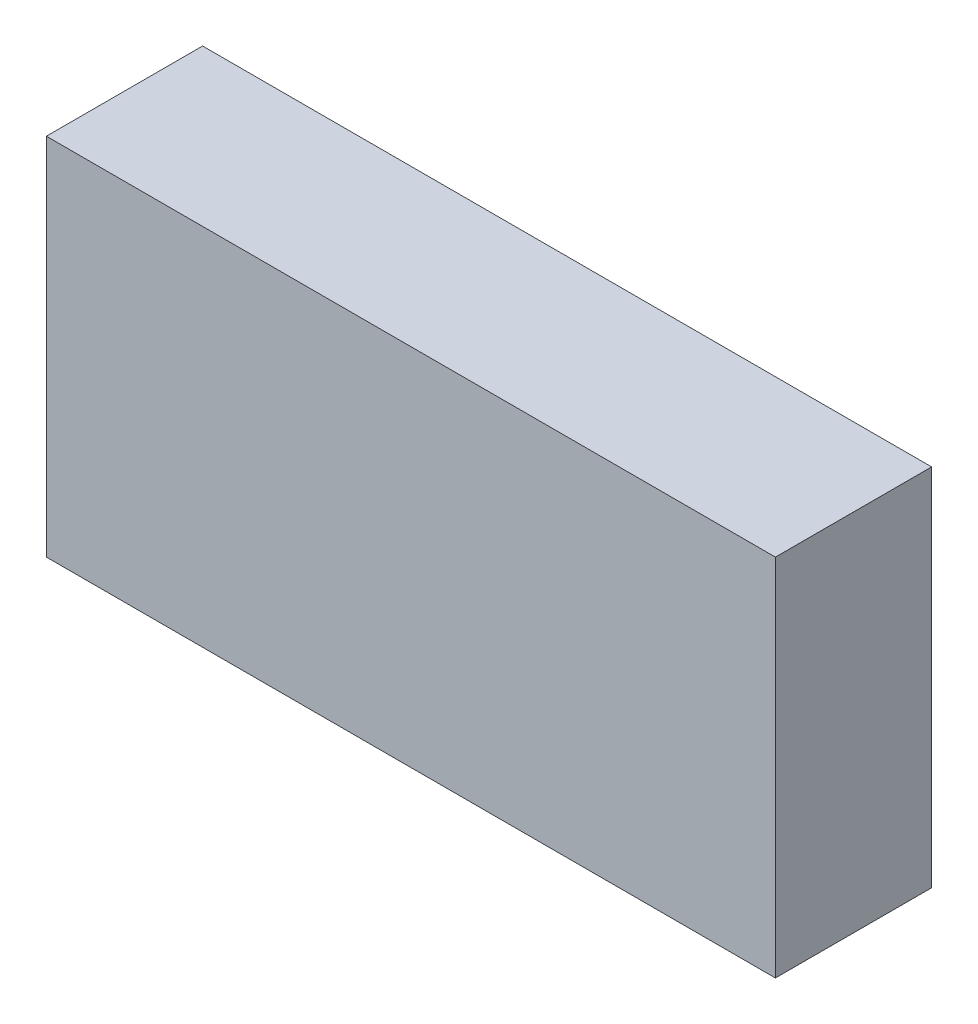
ISO-10303-21;
HEADER;
FILE_DESCRIPTION(('STEP AP214'),'2;1');
FILE_NAME('part.step','',(''),(''),'','','');
FILE_SCHEMA(('AUTOMOTIVE_DESIGN { 1 0 10303 214 1 1 1 1 }'));
ENDSEC;
DATA;
#1=APPLICATION_CONTEXT('core data for automotive mechanical design processes');
#2=APPLICATION_PROTOCOL_DEFINITION('international standard','automotive_design',2000,#1);
#3=PRODUCT_CONTEXT('',#1,'mechanical');
#4=PRODUCT('Part','Part','',(#3));
#5=PRODUCT_RELATED_PRODUCT_CATEGORY('part','',(#4));
#6=PRODUCT_DEFINITION_FORMATION('','',#4);
#7=PRODUCT_DEFINITION_CONTEXT('part definition',#1,'design');
#8=PRODUCT_DEFINITION('design','',#6,#7);
#9=PRODUCT_DEFINITION_SHAPE('','',#8);
#10=(LENGTH_UNIT() NAMED_UNIT(*) SI_UNIT(.MILLI.,.METRE.));
#11=(NAMED_UNIT(*) PLANE_ANGLE_UNIT() SI_UNIT($,.RADIAN.));
#12=(NAMED_UNIT(*) SI_UNIT($,.STERADIAN.) SOLID_ANGLE_UNIT());
#13=UNCERTAINTY_MEASURE_WITH_UNIT(LENGTH_MEASURE(1.E-05),#10,'distance_accuracy_value','');
#14=(GEOMETRIC_REPRESENTATION_CONTEXT(3) GLOBAL_UNCERTAINTY_ASSIGNED_CONTEXT((#13)) GLOBAL_UNIT_ASSIGNED_CONTEXT((#10,
#11,#12)) REPRESENTATION_CONTEXT('',''));
#15=CARTESIAN_POINT('',(0.,0.,0.));
#16=DIRECTION('',(0.,0.,1.));
#17=DIRECTION('',(1.,0.,0.));
#18=AXIS2_PLACEMENT_3D('',#15,#16,#17);
#19=CARTESIAN_POINT('',(0.,0.,15.));
#20=DIRECTION('',(1.,0.,0.));
#21=DIRECTION('',(0.,0.,-1.));
#22=AXIS2_PLACEMENT_3D('',#19,#20,#21);
#23=PLANE('',#22);
#24=DIRECTION('',(0.,-1.,0.));
#25=VECTOR('',#24,1.);
#26=CARTESIAN_POINT('',(0.,0.,0.));
#27=LINE('',#26,#25);
#28=CARTESIAN_POINT('',(0.,35.,0.));
#29=VERTEX_POINT('',#28);
#30=CARTESIAN_POINT('',(0.,0.,0.));
#31=VERTEX_POINT('',#30);
#32=EDGE_CURVE('E96',#29,#31,#27,.T.);
#33=ORIENTED_EDGE('',*,*,#32,.T.);
#34=DIRECTION('',(0.,0.,-1.));
#35=VECTOR('',#34,1.);
#36=CARTESIAN_POINT('',(0.,0.,15.));
#37=LINE('',#36,#35);
#38=CARTESIAN_POINT('',(0.,0.,15.));
#39=VERTEX_POINT('',#38);
#40=EDGE_CURVE('E11',#39,#31,#37,.T.);
#41=ORIENTED_EDGE('',*,*,#40,.F.);
#42=DIRECTION('',(0.,-1.,0.));
#43=VECTOR('',#42,1.);
#44=CARTESIAN_POINT('',(0.,0.,15.));
#45=LINE('',#44,#43);
#46=CARTESIAN_POINT('',(0.,35.,15.));
#47=VERTEX_POINT('',#46);
#48=EDGE_CURVE('E84',#47,#39,#45,.T.);
#49=ORIENTED_EDGE('',*,*,#48,.F.);
#50=DIRECTION('',(0.,0.,-1.));
#51=VECTOR('',#50,1.);
#52=CARTESIAN_POINT('',(0.,35.,15.));
#53=LINE('',#52,#51);
#54=EDGE_CURVE('E92',#47,#29,#53,.T.);
#55=ORIENTED_EDGE('',*,*,#54,.T.);
#56=EDGE_LOOP('',(#33,#41,#49,#55));
#57=FACE_BOUND('',#56,.T.);
#58=ADVANCED_FACE('F33',(#57),#23,.F.);
#59=CARTESIAN_POINT('',(0.,0.,15.));
#60=DIRECTION('',(0.,1.,0.));
#61=DIRECTION('',(0.,0.,1.));
#62=AXIS2_PLACEMENT_3D('',#59,#60,#61);
#63=PLANE('',#62);
#64=DIRECTION('',(1.,0.,0.));
#65=VECTOR('',#64,1.);
#66=CARTESIAN_POINT('',(0.,0.,0.));
#67=LINE('',#66,#65);
#68=CARTESIAN_POINT('',(70.,0.,0.));
#69=VERTEX_POINT('',#68);
#70=EDGE_CURVE('E88',#31,#69,#67,.T.);
#71=ORIENTED_EDGE('',*,*,#70,.T.);
#72=DIRECTION('',(0.,0.,-1.));
#73=VECTOR('',#72,1.);
#74=CARTESIAN_POINT('',(70.,0.,15.));
#75=LINE('',#74,#73);
#76=CARTESIAN_POINT('',(70.,0.,15.));
#77=VERTEX_POINT('',#76);
#78=EDGE_CURVE('E41',#77,#69,#75,.T.);
#79=ORIENTED_EDGE('',*,*,#78,.F.);
#80=DIRECTION('',(1.,0.,0.));
#81=VECTOR('',#80,1.);
#82=CARTESIAN_POINT('',(0.,0.,15.));
#83=LINE('',#82,#81);
#84=EDGE_CURVE('E79',#39,#77,#83,.T.);
#85=ORIENTED_EDGE('',*,*,#84,.F.);
#86=ORIENTED_EDGE('',*,*,#40,.T.);
#87=EDGE_LOOP('',(#71,#79,#85,#86));
#88=FACE_BOUND('',#87,.T.);
#89=ADVANCED_FACE('F87',(#88),#63,.F.);
#90=CARTESIAN_POINT('',(70.,0.,15.));
#91=DIRECTION('',(-1.,0.,0.));
#92=DIRECTION('',(0.,0.,1.));
#93=AXIS2_PLACEMENT_3D('',#90,#91,#92);
#94=PLANE('',#93);
#95=DIRECTION('',(0.,1.,0.));
#96=VECTOR('',#95,1.);
#97=CARTESIAN_POINT('',(70.,0.,0.));
#98=LINE('',#97,#96);
#99=CARTESIAN_POINT('',(70.,35.,0.));
#100=VERTEX_POINT('',#99);
#101=EDGE_CURVE('E66',#69,#100,#98,.T.);
#102=ORIENTED_EDGE('',*,*,#101,.T.);
#103=DIRECTION('',(0.,0.,-1.));
#104=VECTOR('',#103,1.);
#105=CARTESIAN_POINT('',(70.,35.,15.));
#106=LINE('',#105,#104);
#107=CARTESIAN_POINT('',(70.,35.,15.));
#108=VERTEX_POINT('',#107);
#109=EDGE_CURVE('E89',#108,#100,#106,.T.);
#110=ORIENTED_EDGE('',*,*,#109,.F.);
#111=DIRECTION('',(0.,1.,0.));
#112=VECTOR('',#111,1.);
#113=CARTESIAN_POINT('',(70.,0.,15.));
#114=LINE('',#113,#112);
#115=EDGE_CURVE('E82',#77,#108,#114,.T.);
#116=ORIENTED_EDGE('',*,*,#115,.F.);
#117=ORIENTED_EDGE('',*,*,#78,.T.);
#118=EDGE_LOOP('',(#102,#110,#116,#117));
#119=FACE_BOUND('',#118,.T.);
#120=ADVANCED_FACE('F90',(#119),#94,.F.);
#121=CARTESIAN_POINT('',(0.,35.,15.));
#122=DIRECTION('',(0.,-1.,0.));
#123=DIRECTION('',(0.,0.,-1.));
#124=AXIS2_PLACEMENT_3D('',#121,#122,#123);
#125=PLANE('',#124);
#126=DIRECTION('',(-1.,0.,0.));
#127=VECTOR('',#126,1.);
#128=CARTESIAN_POINT('',(0.,35.,0.));
#129=LINE('',#128,#127);
#130=EDGE_CURVE('E72',#100,#29,#129,.T.);
#131=ORIENTED_EDGE('',*,*,#130,.T.);
#132=ORIENTED_EDGE('',*,*,#54,.F.);
#133=DIRECTION('',(-1.,0.,0.));
#134=VECTOR('',#133,1.);
#135=CARTESIAN_POINT('',(0.,35.,15.));
#136=LINE('',#135,#134);
#137=EDGE_CURVE('E49',#108,#47,#136,.T.);
#138=ORIENTED_EDGE('',*,*,#137,.F.);
#139=ORIENTED_EDGE('',*,*,#109,.T.);
#140=EDGE_LOOP('',(#131,#132,#138,#139));
#141=FACE_BOUND('',#140,.T.);
#142=ADVANCED_FACE('F103',(#141),#125,.F.);
#143=CARTESIAN_POINT('',(0.,0.,15.));
#144=DIRECTION('',(0.,0.,-1.));
#145=DIRECTION('',(-1.,0.,0.));
#146=AXIS2_PLACEMENT_3D('',#143,#144,#145);
#147=PLANE('',#146);
#148=ORIENTED_EDGE('',*,*,#48,.T.);
#149=ORIENTED_EDGE('',*,*,#84,.T.);
#150=ORIENTED_EDGE('',*,*,#115,.T.);
#151=ORIENTED_EDGE('',*,*,#137,.T.);
#152=EDGE_LOOP('',(#148,#149,#150,#151));
#153=FACE_BOUND('',#152,.T.);
#154=ADVANCED_FACE('F80',(#153),#147,.F.);
#155=CARTESIAN_POINT('',(0.,0.,0.));
#156=DIRECTION('',(0.,0.,-1.));
#157=DIRECTION('',(-1.,0.,0.));
#158=AXIS2_PLACEMENT_3D('',#155,#156,#157);
#159=PLANE('',#158);
#160=ORIENTED_EDGE('',*,*,#32,.F.);
#161=ORIENTED_EDGE('',*,*,#130,.F.);
#162=ORIENTED_EDGE('',*,*,#101,.F.);
#163=ORIENTED_EDGE('',*,*,#70,.F.);
#164=EDGE_LOOP('',(#160,#161,#162,#163));
#165=FACE_BOUND('',#164,.T.);
#166=ADVANCED_FACE('F106',(#165),#159,.T.);
#167=CLOSED_SHELL('',(#58,#89,#120,#142,#154,#166));
#168=MANIFOLD_SOLID_BREP('B2',#167);
#169=ADVANCED_BREP_SHAPE_REPRESENTATION('',(#18,#168),#14);
#170=SHAPE_DEFINITION_REPRESENTATION(#9,#169);
ENDSEC;
END-ISO-10303-21;
